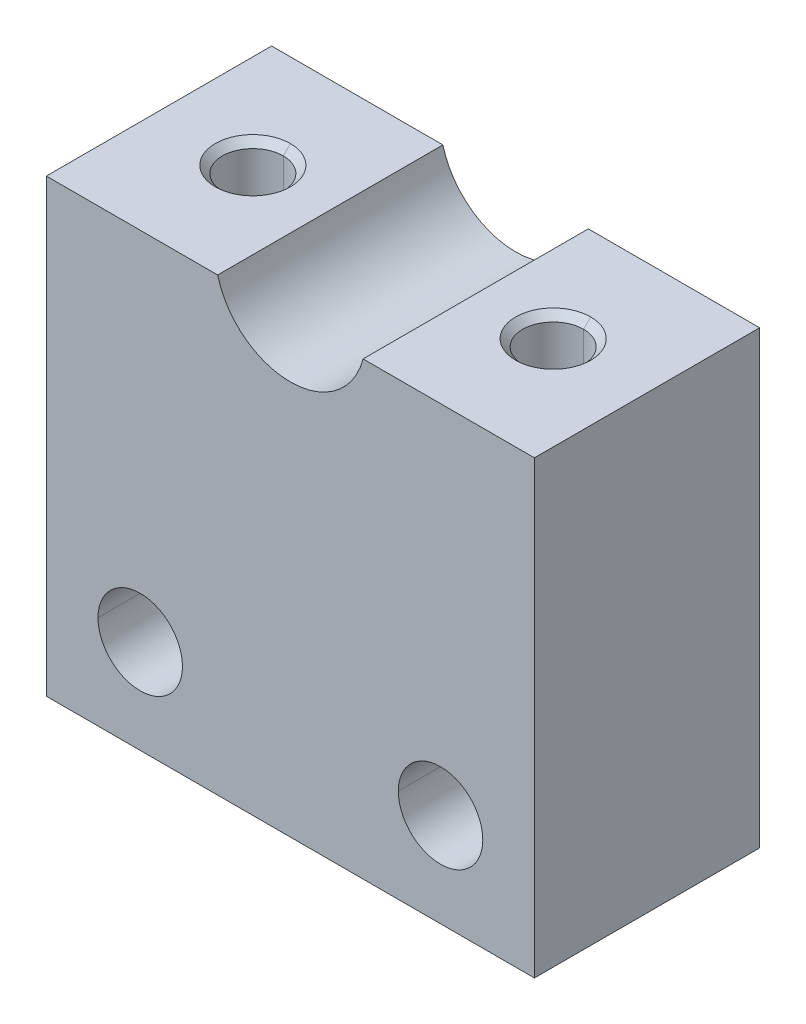
ISO-10303-21;
HEADER;
FILE_DESCRIPTION(('STEP AP214'),'2;1');
FILE_NAME('part.step','',(''),(''),'','','');
FILE_SCHEMA(('AUTOMOTIVE_DESIGN { 1 0 10303 214 1 1 1 1 }'));
ENDSEC;
DATA;
#1=APPLICATION_CONTEXT('core data for automotive mechanical design processes');
#2=APPLICATION_PROTOCOL_DEFINITION('international standard','automotive_design',2000,#1);
#3=PRODUCT_CONTEXT('',#1,'mechanical');
#4=PRODUCT('Part','Part','',(#3));
#5=PRODUCT_RELATED_PRODUCT_CATEGORY('part','',(#4));
#6=PRODUCT_DEFINITION_FORMATION('','',#4);
#7=PRODUCT_DEFINITION_CONTEXT('part definition',#1,'design');
#8=PRODUCT_DEFINITION('design','',#6,#7);
#9=PRODUCT_DEFINITION_SHAPE('','',#8);
#10=(LENGTH_UNIT() NAMED_UNIT(*) SI_UNIT(.MILLI.,.METRE.));
#11=(NAMED_UNIT(*) PLANE_ANGLE_UNIT() SI_UNIT($,.RADIAN.));
#12=(NAMED_UNIT(*) SI_UNIT($,.STERADIAN.) SOLID_ANGLE_UNIT());
#13=UNCERTAINTY_MEASURE_WITH_UNIT(LENGTH_MEASURE(1.E-05),#10,'distance_accuracy_value','');
#14=(GEOMETRIC_REPRESENTATION_CONTEXT(3) GLOBAL_UNCERTAINTY_ASSIGNED_CONTEXT((#13)) GLOBAL_UNIT_ASSIGNED_CONTEXT((#10,
#11,#12)) REPRESENTATION_CONTEXT('',''));
#15=CARTESIAN_POINT('',(0.,0.,0.));
#16=DIRECTION('',(0.,0.,1.));
#17=DIRECTION('',(1.,0.,0.));
#18=AXIS2_PLACEMENT_3D('',#15,#16,#17);
#19=CARTESIAN_POINT('',(-3.8729833462074,24.,6.));
#20=DIRECTION('',(0.,-1.,0.));
#21=DIRECTION('',(0.,0.,-1.));
#22=AXIS2_PLACEMENT_3D('',#19,#20,#21);
#23=PLANE('',#22);
#24=CARTESIAN_POINT('',(-8.,24.,0.));
#25=DIRECTION('',(0.,1.,0.));
#26=DIRECTION('',(0.,0.,1.));
#27=AXIS2_PLACEMENT_3D('',#24,#25,#26);
#28=CIRCLE('',#27,2.);
#29=CARTESIAN_POINT('',(-8.,24.,-2.));
#30=VERTEX_POINT('',#29);
#31=CARTESIAN_POINT('',(-8.,24.,2.));
#32=VERTEX_POINT('',#31);
#33=EDGE_CURVE('E11',#30,#32,#28,.T.);
#34=ORIENTED_EDGE('',*,*,#33,.F.);
#35=CARTESIAN_POINT('',(-8.,24.,0.));
#36=DIRECTION('',(0.,1.,0.));
#37=DIRECTION('',(0.,0.,1.));
#38=AXIS2_PLACEMENT_3D('',#35,#36,#37);
#39=CIRCLE('',#38,2.);
#40=EDGE_CURVE('E25',#32,#30,#39,.T.);
#41=ORIENTED_EDGE('',*,*,#40,.F.);
#42=EDGE_LOOP('',(#34,#41));
#43=FACE_BOUND('',#42,.T.);
#44=DIRECTION('',(-1.,0.,0.));
#45=VECTOR('',#44,1.);
#46=CARTESIAN_POINT('',(-3.8729833462074,24.,-6.));
#47=LINE('',#46,#45);
#48=CARTESIAN_POINT('',(-3.8729833462074,24.,-6.));
#49=VERTEX_POINT('',#48);
#50=CARTESIAN_POINT('',(-13.,24.,-6.));
#51=VERTEX_POINT('',#50);
#52=EDGE_CURVE('E389',#49,#51,#47,.T.);
#53=ORIENTED_EDGE('',*,*,#52,.T.);
#54=DIRECTION('',(0.,0.,-1.));
#55=VECTOR('',#54,1.);
#56=CARTESIAN_POINT('',(-13.,24.,6.));
#57=LINE('',#56,#55);
#58=CARTESIAN_POINT('',(-13.,24.,6.));
#59=VERTEX_POINT('',#58);
#60=EDGE_CURVE('E384',#59,#51,#57,.T.);
#61=ORIENTED_EDGE('',*,*,#60,.F.);
#62=DIRECTION('',(-1.,0.,0.));
#63=VECTOR('',#62,1.);
#64=CARTESIAN_POINT('',(-3.8729833462074,24.,6.));
#65=LINE('',#64,#63);
#66=CARTESIAN_POINT('',(-3.8729833462074,24.,6.));
#67=VERTEX_POINT('',#66);
#68=EDGE_CURVE('E378',#67,#59,#65,.T.);
#69=ORIENTED_EDGE('',*,*,#68,.F.);
#70=DIRECTION('',(0.,0.,-1.));
#71=VECTOR('',#70,1.);
#72=CARTESIAN_POINT('',(-3.8729833462074,24.,6.));
#73=LINE('',#72,#71);
#74=EDGE_CURVE('E373',#67,#49,#73,.T.);
#75=ORIENTED_EDGE('',*,*,#74,.T.);
#76=EDGE_LOOP('',(#53,#61,#69,#75));
#77=FACE_BOUND('',#76,.T.);
#78=ADVANCED_FACE('F17',(#43,#77),#23,.F.);
#79=CARTESIAN_POINT('',(0.,25.,6.));
#80=DIRECTION('',(0.,0.,-1.));
#81=DIRECTION('',(0.,1.,0.));
#82=AXIS2_PLACEMENT_3D('',#79,#80,#81);
#83=CYLINDRICAL_SURFACE('',#82,4.);
#84=CARTESIAN_POINT('',(0.,25.,-6.));
#85=DIRECTION('',(0.,0.,1.));
#86=DIRECTION('',(1.,0.,0.));
#87=AXIS2_PLACEMENT_3D('',#84,#85,#86);
#88=CIRCLE('',#87,4.);
#89=CARTESIAN_POINT('',(3.8729833462074,24.,-6.));
#90=VERTEX_POINT('',#89);
#91=EDGE_CURVE('E367',#49,#90,#88,.T.);
#92=ORIENTED_EDGE('',*,*,#91,.F.);
#93=ORIENTED_EDGE('',*,*,#74,.F.);
#94=CARTESIAN_POINT('',(0.,25.,6.));
#95=DIRECTION('',(0.,0.,1.));
#96=DIRECTION('',(1.,0.,0.));
#97=AXIS2_PLACEMENT_3D('',#94,#95,#96);
#98=CIRCLE('',#97,4.);
#99=CARTESIAN_POINT('',(3.8729833462074,24.,6.));
#100=VERTEX_POINT('',#99);
#101=EDGE_CURVE('E362',#67,#100,#98,.T.);
#102=ORIENTED_EDGE('',*,*,#101,.T.);
#103=DIRECTION('',(0.,0.,-1.));
#104=VECTOR('',#103,1.);
#105=CARTESIAN_POINT('',(3.8729833462074,24.,6.));
#106=LINE('',#105,#104);
#107=EDGE_CURVE('E357',#100,#90,#106,.T.);
#108=ORIENTED_EDGE('',*,*,#107,.T.);
#109=EDGE_LOOP('',(#92,#93,#102,#108));
#110=FACE_BOUND('',#109,.T.);
#111=ADVANCED_FACE('F422',(#110),#83,.F.);
#112=CARTESIAN_POINT('',(13.,24.,6.));
#113=DIRECTION('',(0.,-1.,0.));
#114=DIRECTION('',(0.,0.,-1.));
#115=AXIS2_PLACEMENT_3D('',#112,#113,#114);
#116=PLANE('',#115);
#117=CARTESIAN_POINT('',(8.,24.,0.));
#118=DIRECTION('',(0.,1.,0.));
#119=DIRECTION('',(0.,0.,1.));
#120=AXIS2_PLACEMENT_3D('',#117,#118,#119);
#121=CIRCLE('',#120,2.);
#122=CARTESIAN_POINT('',(8.,24.,-2.));
#123=VERTEX_POINT('',#122);
#124=CARTESIAN_POINT('',(8.,24.,2.));
#125=VERTEX_POINT('',#124);
#126=EDGE_CURVE('E351',#123,#125,#121,.T.);
#127=ORIENTED_EDGE('',*,*,#126,.F.);
#128=CARTESIAN_POINT('',(8.,24.,0.));
#129=DIRECTION('',(0.,1.,0.));
#130=DIRECTION('',(0.,0.,1.));
#131=AXIS2_PLACEMENT_3D('',#128,#129,#130);
#132=CIRCLE('',#131,2.);
#133=EDGE_CURVE('E346',#125,#123,#132,.T.);
#134=ORIENTED_EDGE('',*,*,#133,.F.);
#135=EDGE_LOOP('',(#127,#134));
#136=FACE_BOUND('',#135,.T.);
#137=DIRECTION('',(-1.,0.,0.));
#138=VECTOR('',#137,1.);
#139=CARTESIAN_POINT('',(13.,24.,-6.));
#140=LINE('',#139,#138);
#141=CARTESIAN_POINT('',(13.,24.,-6.));
#142=VERTEX_POINT('',#141);
#143=EDGE_CURVE('E340',#142,#90,#140,.T.);
#144=ORIENTED_EDGE('',*,*,#143,.T.);
#145=ORIENTED_EDGE('',*,*,#107,.F.);
#146=DIRECTION('',(-1.,0.,0.));
#147=VECTOR('',#146,1.);
#148=CARTESIAN_POINT('',(13.,24.,6.));
#149=LINE('',#148,#147);
#150=CARTESIAN_POINT('',(13.,24.,6.));
#151=VERTEX_POINT('',#150);
#152=EDGE_CURVE('E334',#151,#100,#149,.T.);
#153=ORIENTED_EDGE('',*,*,#152,.F.);
#154=DIRECTION('',(0.,0.,-1.));
#155=VECTOR('',#154,1.);
#156=CARTESIAN_POINT('',(13.,24.,6.));
#157=LINE('',#156,#155);
#158=EDGE_CURVE('E330',#151,#142,#157,.T.);
#159=ORIENTED_EDGE('',*,*,#158,.T.);
#160=EDGE_LOOP('',(#144,#145,#153,#159));
#161=FACE_BOUND('',#160,.T.);
#162=ADVANCED_FACE('F427',(#136,#161),#116,.F.);
#163=CARTESIAN_POINT('',(13.,0.,6.));
#164=DIRECTION('',(-1.,0.,0.));
#165=DIRECTION('',(0.,0.,1.));
#166=AXIS2_PLACEMENT_3D('',#163,#164,#165);
#167=PLANE('',#166);
#168=DIRECTION('',(0.,1.,0.));
#169=VECTOR('',#168,1.);
#170=CARTESIAN_POINT('',(13.,0.,-6.));
#171=LINE('',#170,#169);
#172=CARTESIAN_POINT('',(13.,0.,-6.));
#173=VERTEX_POINT('',#172);
#174=EDGE_CURVE('E325',#173,#142,#171,.T.);
#175=ORIENTED_EDGE('',*,*,#174,.T.);
#176=ORIENTED_EDGE('',*,*,#158,.F.);
#177=DIRECTION('',(0.,1.,0.));
#178=VECTOR('',#177,1.);
#179=CARTESIAN_POINT('',(13.,0.,6.));
#180=LINE('',#179,#178);
#181=CARTESIAN_POINT('',(13.,0.,6.));
#182=VERTEX_POINT('',#181);
#183=EDGE_CURVE('E320',#182,#151,#180,.T.);
#184=ORIENTED_EDGE('',*,*,#183,.F.);
#185=DIRECTION('',(0.,0.,-1.));
#186=VECTOR('',#185,1.);
#187=CARTESIAN_POINT('',(13.,0.,6.));
#188=LINE('',#187,#186);
#189=EDGE_CURVE('E316',#182,#173,#188,.T.);
#190=ORIENTED_EDGE('',*,*,#189,.T.);
#191=EDGE_LOOP('',(#175,#176,#184,#190));
#192=FACE_BOUND('',#191,.T.);
#193=ADVANCED_FACE('F450',(#192),#167,.F.);
#194=CARTESIAN_POINT('',(-13.,0.,6.));
#195=DIRECTION('',(0.,1.,0.));
#196=DIRECTION('',(0.,0.,1.));
#197=AXIS2_PLACEMENT_3D('',#194,#195,#196);
#198=PLANE('',#197);
#199=DIRECTION('',(1.,0.,0.));
#200=VECTOR('',#199,1.);
#201=CARTESIAN_POINT('',(-13.,0.,-6.));
#202=LINE('',#201,#200);
#203=CARTESIAN_POINT('',(-13.,0.,-6.));
#204=VERTEX_POINT('',#203);
#205=EDGE_CURVE('E311',#204,#173,#202,.T.);
#206=ORIENTED_EDGE('',*,*,#205,.T.);
#207=ORIENTED_EDGE('',*,*,#189,.F.);
#208=DIRECTION('',(1.,0.,0.));
#209=VECTOR('',#208,1.);
#210=CARTESIAN_POINT('',(-13.,0.,6.));
#211=LINE('',#210,#209);
#212=CARTESIAN_POINT('',(-13.,0.,6.));
#213=VERTEX_POINT('',#212);
#214=EDGE_CURVE('E306',#213,#182,#211,.T.);
#215=ORIENTED_EDGE('',*,*,#214,.F.);
#216=DIRECTION('',(0.,0.,-1.));
#217=VECTOR('',#216,1.);
#218=CARTESIAN_POINT('',(-13.,0.,6.));
#219=LINE('',#218,#217);
#220=EDGE_CURVE('E302',#213,#204,#219,.T.);
#221=ORIENTED_EDGE('',*,*,#220,.T.);
#222=EDGE_LOOP('',(#206,#207,#215,#221));
#223=FACE_BOUND('',#222,.T.);
#224=ADVANCED_FACE('F453',(#223),#198,.F.);
#225=CARTESIAN_POINT('',(-13.,24.,6.));
#226=DIRECTION('',(1.,0.,0.));
#227=DIRECTION('',(0.,0.,-1.));
#228=AXIS2_PLACEMENT_3D('',#225,#226,#227);
#229=PLANE('',#228);
#230=DIRECTION('',(0.,-1.,0.));
#231=VECTOR('',#230,1.);
#232=CARTESIAN_POINT('',(-13.,24.,-6.));
#233=LINE('',#232,#231);
#234=EDGE_CURVE('E297',#51,#204,#233,.T.);
#235=ORIENTED_EDGE('',*,*,#234,.T.);
#236=ORIENTED_EDGE('',*,*,#220,.F.);
#237=DIRECTION('',(0.,-1.,0.));
#238=VECTOR('',#237,1.);
#239=CARTESIAN_POINT('',(-13.,24.,6.));
#240=LINE('',#239,#238);
#241=EDGE_CURVE('E292',#59,#213,#240,.T.);
#242=ORIENTED_EDGE('',*,*,#241,.F.);
#243=ORIENTED_EDGE('',*,*,#60,.T.);
#244=EDGE_LOOP('',(#235,#236,#242,#243));
#245=FACE_BOUND('',#244,.T.);
#246=ADVANCED_FACE('F441',(#245),#229,.F.);
#247=CARTESIAN_POINT('',(0.,25.,6.));
#248=DIRECTION('',(0.,0.,1.));
#249=DIRECTION('',(1.,0.,0.));
#250=AXIS2_PLACEMENT_3D('',#247,#248,#249);
#251=PLANE('',#250);
#252=CARTESIAN_POINT('',(-8.,5.,6.));
#253=DIRECTION('',(0.,0.,1.));
#254=DIRECTION('',(1.,0.,0.));
#255=AXIS2_PLACEMENT_3D('',#252,#253,#254);
#256=CIRCLE('',#255,2.25);
#257=CARTESIAN_POINT('',(-10.25,5.,6.));
#258=VERTEX_POINT('',#257);
#259=CARTESIAN_POINT('',(-5.75,5.,6.));
#260=VERTEX_POINT('',#259);
#261=EDGE_CURVE('E287',#258,#260,#256,.T.);
#262=ORIENTED_EDGE('',*,*,#261,.F.);
#263=CARTESIAN_POINT('',(-8.,5.,6.));
#264=DIRECTION('',(0.,0.,1.));
#265=DIRECTION('',(1.,0.,0.));
#266=AXIS2_PLACEMENT_3D('',#263,#264,#265);
#267=CIRCLE('',#266,2.25);
#268=EDGE_CURVE('E282',#260,#258,#267,.T.);
#269=ORIENTED_EDGE('',*,*,#268,.F.);
#270=EDGE_LOOP('',(#262,#269));
#271=FACE_BOUND('',#270,.T.);
#272=CARTESIAN_POINT('',(8.,5.,6.));
#273=DIRECTION('',(0.,0.,1.));
#274=DIRECTION('',(1.,0.,0.));
#275=AXIS2_PLACEMENT_3D('',#272,#273,#274);
#276=CIRCLE('',#275,2.25);
#277=CARTESIAN_POINT('',(5.75,5.,6.));
#278=VERTEX_POINT('',#277);
#279=CARTESIAN_POINT('',(10.25,5.,6.));
#280=VERTEX_POINT('',#279);
#281=EDGE_CURVE('E277',#278,#280,#276,.T.);
#282=ORIENTED_EDGE('',*,*,#281,.F.);
#283=CARTESIAN_POINT('',(8.,5.,6.));
#284=DIRECTION('',(0.,0.,1.));
#285=DIRECTION('',(1.,0.,0.));
#286=AXIS2_PLACEMENT_3D('',#283,#284,#285);
#287=CIRCLE('',#286,2.25);
#288=EDGE_CURVE('E272',#280,#278,#287,.T.);
#289=ORIENTED_EDGE('',*,*,#288,.F.);
#290=EDGE_LOOP('',(#282,#289));
#291=FACE_BOUND('',#290,.T.);
#292=ORIENTED_EDGE('',*,*,#68,.T.);
#293=ORIENTED_EDGE('',*,*,#241,.T.);
#294=ORIENTED_EDGE('',*,*,#214,.T.);
#295=ORIENTED_EDGE('',*,*,#183,.T.);
#296=ORIENTED_EDGE('',*,*,#152,.T.);
#297=ORIENTED_EDGE('',*,*,#101,.F.);
#298=EDGE_LOOP('',(#292,#293,#294,#295,#296,#297));
#299=FACE_BOUND('',#298,.T.);
#300=ADVANCED_FACE('F444',(#271,#291,#299),#251,.T.);
#301=CARTESIAN_POINT('',(8.,5.,6.));
#302=DIRECTION('',(0.,0.,-1.));
#303=DIRECTION('',(0.,-1.,0.));
#304=AXIS2_PLACEMENT_3D('',#301,#302,#303);
#305=CYLINDRICAL_SURFACE('',#304,2.25);
#306=DIRECTION('',(0.,0.,-1.));
#307=VECTOR('',#306,1.);
#308=CARTESIAN_POINT('',(10.25,5.,6.));
#309=LINE('',#308,#307);
#310=CARTESIAN_POINT('',(10.25,5.,-6.));
#311=VERTEX_POINT('',#310);
#312=EDGE_CURVE('E267',#280,#311,#309,.T.);
#313=ORIENTED_EDGE('',*,*,#312,.F.);
#314=ORIENTED_EDGE('',*,*,#288,.T.);
#315=DIRECTION('',(0.,0.,-1.));
#316=VECTOR('',#315,1.);
#317=CARTESIAN_POINT('',(5.75,5.,6.));
#318=LINE('',#317,#316);
#319=CARTESIAN_POINT('',(5.75,5.,-6.));
#320=VERTEX_POINT('',#319);
#321=EDGE_CURVE('E263',#278,#320,#318,.T.);
#322=ORIENTED_EDGE('',*,*,#321,.T.);
#323=CARTESIAN_POINT('',(8.,5.,-6.));
#324=DIRECTION('',(0.,0.,1.));
#325=DIRECTION('',(1.,0.,0.));
#326=AXIS2_PLACEMENT_3D('',#323,#324,#325);
#327=CIRCLE('',#326,2.25);
#328=EDGE_CURVE('E258',#311,#320,#327,.T.);
#329=ORIENTED_EDGE('',*,*,#328,.F.);
#330=EDGE_LOOP('',(#313,#314,#322,#329));
#331=FACE_BOUND('',#330,.T.);
#332=ADVANCED_FACE('F512',(#331),#305,.F.);
#333=CARTESIAN_POINT('',(0.,25.,-6.));
#334=DIRECTION('',(0.,0.,1.));
#335=DIRECTION('',(1.,0.,0.));
#336=AXIS2_PLACEMENT_3D('',#333,#334,#335);
#337=PLANE('',#336);
#338=CARTESIAN_POINT('',(-8.,5.,-6.));
#339=DIRECTION('',(0.,0.,1.));
#340=DIRECTION('',(1.,0.,0.));
#341=AXIS2_PLACEMENT_3D('',#338,#339,#340);
#342=CIRCLE('',#341,2.25);
#343=CARTESIAN_POINT('',(-5.75,5.,-6.));
#344=VERTEX_POINT('',#343);
#345=CARTESIAN_POINT('',(-10.25,5.,-6.));
#346=VERTEX_POINT('',#345);
#347=EDGE_CURVE('E254',#344,#346,#342,.T.);
#348=ORIENTED_EDGE('',*,*,#347,.T.);
#349=CARTESIAN_POINT('',(-8.,5.,-6.));
#350=DIRECTION('',(0.,0.,1.));
#351=DIRECTION('',(1.,0.,0.));
#352=AXIS2_PLACEMENT_3D('',#349,#350,#351);
#353=CIRCLE('',#352,2.25);
#354=EDGE_CURVE('E250',#346,#344,#353,.T.);
#355=ORIENTED_EDGE('',*,*,#354,.T.);
#356=EDGE_LOOP('',(#348,#355));
#357=FACE_BOUND('',#356,.T.);
#358=ORIENTED_EDGE('',*,*,#328,.T.);
#359=CARTESIAN_POINT('',(8.,5.,-6.));
#360=DIRECTION('',(0.,0.,1.));
#361=DIRECTION('',(1.,0.,0.));
#362=AXIS2_PLACEMENT_3D('',#359,#360,#361);
#363=CIRCLE('',#362,2.25);
#364=EDGE_CURVE('E245',#320,#311,#363,.T.);
#365=ORIENTED_EDGE('',*,*,#364,.T.);
#366=EDGE_LOOP('',(#358,#365));
#367=FACE_BOUND('',#366,.T.);
#368=ORIENTED_EDGE('',*,*,#52,.F.);
#369=ORIENTED_EDGE('',*,*,#91,.T.);
#370=ORIENTED_EDGE('',*,*,#143,.F.);
#371=ORIENTED_EDGE('',*,*,#174,.F.);
#372=ORIENTED_EDGE('',*,*,#205,.F.);
#373=ORIENTED_EDGE('',*,*,#234,.F.);
#374=EDGE_LOOP('',(#368,#369,#370,#371,#372,#373));
#375=FACE_BOUND('',#374,.T.);
#376=ADVANCED_FACE('F437',(#357,#367,#375),#337,.F.);
#377=CARTESIAN_POINT('',(8.,5.,6.));
#378=DIRECTION('',(0.,0.,-1.));
#379=DIRECTION('',(0.,1.,0.));
#380=AXIS2_PLACEMENT_3D('',#377,#378,#379);
#381=CYLINDRICAL_SURFACE('',#380,2.25);
#382=ORIENTED_EDGE('',*,*,#312,.T.);
#383=ORIENTED_EDGE('',*,*,#364,.F.);
#384=ORIENTED_EDGE('',*,*,#321,.F.);
#385=ORIENTED_EDGE('',*,*,#281,.T.);
#386=EDGE_LOOP('',(#382,#383,#384,#385));
#387=FACE_BOUND('',#386,.T.);
#388=ADVANCED_FACE('F506',(#387),#381,.F.);
#389=CARTESIAN_POINT('',(-8.,5.,6.));
#390=DIRECTION('',(0.,0.,-1.));
#391=DIRECTION('',(0.,1.,0.));
#392=AXIS2_PLACEMENT_3D('',#389,#390,#391);
#393=CYLINDRICAL_SURFACE('',#392,2.25);
#394=DIRECTION('',(0.,0.,-1.));
#395=VECTOR('',#394,1.);
#396=CARTESIAN_POINT('',(-5.75,5.,6.));
#397=LINE('',#396,#395);
#398=EDGE_CURVE('E240',#260,#344,#397,.T.);
#399=ORIENTED_EDGE('',*,*,#398,.T.);
#400=ORIENTED_EDGE('',*,*,#354,.F.);
#401=DIRECTION('',(0.,0.,-1.));
#402=VECTOR('',#401,1.);
#403=CARTESIAN_POINT('',(-10.25,5.,6.));
#404=LINE('',#403,#402);
#405=EDGE_CURVE('E235',#258,#346,#404,.T.);
#406=ORIENTED_EDGE('',*,*,#405,.F.);
#407=ORIENTED_EDGE('',*,*,#261,.T.);
#408=EDGE_LOOP('',(#399,#400,#406,#407));
#409=FACE_BOUND('',#408,.T.);
#410=ADVANCED_FACE('F502',(#409),#393,.F.);
#411=CARTESIAN_POINT('',(-8.,5.,6.));
#412=DIRECTION('',(0.,0.,-1.));
#413=DIRECTION('',(0.,-1.,0.));
#414=AXIS2_PLACEMENT_3D('',#411,#412,#413);
#415=CYLINDRICAL_SURFACE('',#414,2.25);
#416=ORIENTED_EDGE('',*,*,#398,.F.);
#417=ORIENTED_EDGE('',*,*,#268,.T.);
#418=ORIENTED_EDGE('',*,*,#405,.T.);
#419=ORIENTED_EDGE('',*,*,#347,.F.);
#420=EDGE_LOOP('',(#416,#417,#418,#419));
#421=FACE_BOUND('',#420,.T.);
#422=ADVANCED_FACE('F499',(#421),#415,.F.);
#423=CARTESIAN_POINT('',(8.,23.621,0.));
#424=DIRECTION('',(0.,1.,0.));
#425=DIRECTION('',(-1.,0.,0.));
#426=AXIS2_PLACEMENT_3D('',#423,#424,#425);
#427=CONICAL_SURFACE('',#426,1.621,0.785398163397448);
#428=DIRECTION('',(0.,0.707106781186549,-0.707106781186546));
#429=VECTOR('',#428,1.);
#430=CARTESIAN_POINT('',(8.,23.621,-1.621));
#431=LINE('',#430,#429);
#432=CARTESIAN_POINT('',(8.,23.621,-1.621));
#433=VERTEX_POINT('',#432);
#434=EDGE_CURVE('E230',#433,#123,#431,.T.);
#435=ORIENTED_EDGE('',*,*,#434,.F.);
#436=CARTESIAN_POINT('',(8.,23.621,0.));
#437=DIRECTION('',(0.,1.,0.));
#438=DIRECTION('',(0.,0.,1.));
#439=AXIS2_PLACEMENT_3D('',#436,#437,#438);
#440=CIRCLE('',#439,1.621);
#441=CARTESIAN_POINT('',(8.,23.621,1.621));
#442=VERTEX_POINT('',#441);
#443=EDGE_CURVE('E225',#442,#433,#440,.T.);
#444=ORIENTED_EDGE('',*,*,#443,.F.);
#445=DIRECTION('',(0.,0.707106781186549,0.707106781186546));
#446=VECTOR('',#445,1.);
#447=CARTESIAN_POINT('',(8.,23.621,1.621));
#448=LINE('',#447,#446);
#449=EDGE_CURVE('E220',#442,#125,#448,.T.);
#450=ORIENTED_EDGE('',*,*,#449,.T.);
#451=ORIENTED_EDGE('',*,*,#133,.T.);
#452=EDGE_LOOP('',(#435,#444,#450,#451));
#453=FACE_BOUND('',#452,.T.);
#454=ADVANCED_FACE('F473',(#453),#427,.F.);
#455=CARTESIAN_POINT('',(8.,23.621,0.));
#456=DIRECTION('',(0.,1.,0.));
#457=DIRECTION('',(1.,0.,0.));
#458=AXIS2_PLACEMENT_3D('',#455,#456,#457);
#459=CONICAL_SURFACE('',#458,1.621,0.785398163397448);
#460=ORIENTED_EDGE('',*,*,#434,.T.);
#461=ORIENTED_EDGE('',*,*,#126,.T.);
#462=ORIENTED_EDGE('',*,*,#449,.F.);
#463=CARTESIAN_POINT('',(8.,23.621,0.));
#464=DIRECTION('',(0.,1.,0.));
#465=DIRECTION('',(0.,0.,1.));
#466=AXIS2_PLACEMENT_3D('',#463,#464,#465);
#467=CIRCLE('',#466,1.621);
#468=EDGE_CURVE('E214',#433,#442,#467,.T.);
#469=ORIENTED_EDGE('',*,*,#468,.F.);
#470=EDGE_LOOP('',(#460,#461,#462,#469));
#471=FACE_BOUND('',#470,.T.);
#472=ADVANCED_FACE('F471',(#471),#459,.F.);
#473=CARTESIAN_POINT('',(8.,24.,0.));
#474=DIRECTION('',(0.,1.,0.));
#475=DIRECTION('',(1.,0.,0.));
#476=AXIS2_PLACEMENT_3D('',#473,#474,#475);
#477=CYLINDRICAL_SURFACE('',#476,1.621);
#478=DIRECTION('',(0.,1.,0.));
#479=VECTOR('',#478,1.);
#480=CARTESIAN_POINT('',(8.,17.935884786356,-1.621));
#481=LINE('',#480,#479);
#482=CARTESIAN_POINT('',(8.,17.935884786356,-1.621));
#483=VERTEX_POINT('',#482);
#484=EDGE_CURVE('E209',#483,#433,#481,.T.);
#485=ORIENTED_EDGE('',*,*,#484,.T.);
#486=ORIENTED_EDGE('',*,*,#468,.T.);
#487=DIRECTION('',(0.,1.,0.));
#488=VECTOR('',#487,1.);
#489=CARTESIAN_POINT('',(8.,17.935884786356,1.621));
#490=LINE('',#489,#488);
#491=CARTESIAN_POINT('',(8.,17.935884786356,1.621));
#492=VERTEX_POINT('',#491);
#493=EDGE_CURVE('E204',#492,#442,#490,.T.);
#494=ORIENTED_EDGE('',*,*,#493,.F.);
#495=CARTESIAN_POINT('',(8.,17.935884786356,0.));
#496=DIRECTION('',(0.,1.,0.));
#497=DIRECTION('',(0.,0.,1.));
#498=AXIS2_PLACEMENT_3D('',#495,#496,#497);
#499=CIRCLE('',#498,1.621);
#500=EDGE_CURVE('E199',#483,#492,#499,.T.);
#501=ORIENTED_EDGE('',*,*,#500,.F.);
#502=EDGE_LOOP('',(#485,#486,#494,#501));
#503=FACE_BOUND('',#502,.T.);
#504=ADVANCED_FACE('F475',(#503),#477,.F.);
#505=CARTESIAN_POINT('',(8.,17.,0.));
#506=DIRECTION('',(0.,1.,0.));
#507=DIRECTION('',(1.,0.,0.));
#508=AXIS2_PLACEMENT_3D('',#505,#506,#507);
#509=CONICAL_SURFACE('',#508,0.,1.04719755119678);
#510=DIRECTION('',(0.,0.499999999999846,-0.866025403784528));
#511=VECTOR('',#510,1.);
#512=CARTESIAN_POINT('',(8.,17.,0.));
#513=LINE('',#512,#511);
#514=CARTESIAN_POINT('',(8.,17.,0.));
#515=VERTEX_POINT('',#514);
#516=EDGE_CURVE('E194',#515,#483,#513,.T.);
#517=ORIENTED_EDGE('',*,*,#516,.T.);
#518=ORIENTED_EDGE('',*,*,#500,.T.);
#519=DIRECTION('',(0.,0.499999999999846,0.866025403784528));
#520=VECTOR('',#519,1.);
#521=CARTESIAN_POINT('',(8.,17.,0.));
#522=LINE('',#521,#520);
#523=EDGE_CURVE('E189',#515,#492,#522,.T.);
#524=ORIENTED_EDGE('',*,*,#523,.F.);
#525=EDGE_LOOP('',(#517,#518,#524));
#526=FACE_BOUND('',#525,.T.);
#527=ADVANCED_FACE('F484',(#526),#509,.F.);
#528=CARTESIAN_POINT('',(8.,17.,0.));
#529=DIRECTION('',(0.,1.,0.));
#530=DIRECTION('',(-1.,0.,0.));
#531=AXIS2_PLACEMENT_3D('',#528,#529,#530);
#532=CONICAL_SURFACE('',#531,0.,1.04719755119678);
#533=ORIENTED_EDGE('',*,*,#523,.T.);
#534=CARTESIAN_POINT('',(8.,17.935884786356,0.));
#535=DIRECTION('',(0.,1.,0.));
#536=DIRECTION('',(0.,0.,1.));
#537=AXIS2_PLACEMENT_3D('',#534,#535,#536);
#538=CIRCLE('',#537,1.621);
#539=EDGE_CURVE('E184',#492,#483,#538,.T.);
#540=ORIENTED_EDGE('',*,*,#539,.T.);
#541=ORIENTED_EDGE('',*,*,#516,.F.);
#542=EDGE_LOOP('',(#533,#540,#541));
#543=FACE_BOUND('',#542,.T.);
#544=ADVANCED_FACE('F482',(#543),#532,.F.);
#545=CARTESIAN_POINT('',(8.,24.,0.));
#546=DIRECTION('',(0.,1.,0.));
#547=DIRECTION('',(-1.,0.,0.));
#548=AXIS2_PLACEMENT_3D('',#545,#546,#547);
#549=CYLINDRICAL_SURFACE('',#548,1.621);
#550=ORIENTED_EDGE('',*,*,#484,.F.);
#551=ORIENTED_EDGE('',*,*,#539,.F.);
#552=ORIENTED_EDGE('',*,*,#493,.T.);
#553=ORIENTED_EDGE('',*,*,#443,.T.);
#554=EDGE_LOOP('',(#550,#551,#552,#553));
#555=FACE_BOUND('',#554,.T.);
#556=ADVANCED_FACE('F479',(#555),#549,.F.);
#557=CARTESIAN_POINT('',(-8.,23.621,0.));
#558=DIRECTION('',(0.,1.,0.));
#559=DIRECTION('',(-1.,0.,0.));
#560=AXIS2_PLACEMENT_3D('',#557,#558,#559);
#561=CONICAL_SURFACE('',#560,1.621,0.785398163397446);
#562=DIRECTION('',(0.,0.707106781186549,-0.707106781186546));
#563=VECTOR('',#562,1.);
#564=CARTESIAN_POINT('',(-8.,23.621,-1.621));
#565=LINE('',#564,#563);
#566=CARTESIAN_POINT('',(-8.,23.621,-1.621));
#567=VERTEX_POINT('',#566);
#568=EDGE_CURVE('E180',#567,#30,#565,.T.);
#569=ORIENTED_EDGE('',*,*,#568,.F.);
#570=CARTESIAN_POINT('',(-8.,23.621,0.));
#571=DIRECTION('',(0.,1.,0.));
#572=DIRECTION('',(0.,0.,1.));
#573=AXIS2_PLACEMENT_3D('',#570,#571,#572);
#574=CIRCLE('',#573,1.621);
#575=CARTESIAN_POINT('',(-8.,23.621,1.621));
#576=VERTEX_POINT('',#575);
#577=EDGE_CURVE('E174',#576,#567,#574,.T.);
#578=ORIENTED_EDGE('',*,*,#577,.F.);
#579=DIRECTION('',(0.,0.707106781186549,0.707106781186546));
#580=VECTOR('',#579,1.);
#581=CARTESIAN_POINT('',(-8.,23.621,1.621));
#582=LINE('',#581,#580);
#583=EDGE_CURVE('E170',#576,#32,#582,.T.);
#584=ORIENTED_EDGE('',*,*,#583,.T.);
#585=ORIENTED_EDGE('',*,*,#40,.T.);
#586=EDGE_LOOP('',(#569,#578,#584,#585));
#587=FACE_BOUND('',#586,.T.);
#588=ADVANCED_FACE('F401',(#587),#561,.F.);
#589=CARTESIAN_POINT('',(-8.,23.621,0.));
#590=DIRECTION('',(0.,1.,0.));
#591=DIRECTION('',(1.,0.,0.));
#592=AXIS2_PLACEMENT_3D('',#589,#590,#591);
#593=CONICAL_SURFACE('',#592,1.621,0.785398163397446);
#594=ORIENTED_EDGE('',*,*,#568,.T.);
#595=ORIENTED_EDGE('',*,*,#33,.T.);
#596=ORIENTED_EDGE('',*,*,#583,.F.);
#597=CARTESIAN_POINT('',(-8.,23.621,0.));
#598=DIRECTION('',(0.,1.,0.));
#599=DIRECTION('',(0.,0.,1.));
#600=AXIS2_PLACEMENT_3D('',#597,#598,#599);
#601=CIRCLE('',#600,1.621);
#602=EDGE_CURVE('E165',#567,#576,#601,.T.);
#603=ORIENTED_EDGE('',*,*,#602,.F.);
#604=EDGE_LOOP('',(#594,#595,#596,#603));
#605=FACE_BOUND('',#604,.T.);
#606=ADVANCED_FACE('F405',(#605),#593,.F.);
#607=CARTESIAN_POINT('',(-8.,24.,0.));
#608=DIRECTION('',(0.,1.,0.));
#609=DIRECTION('',(1.,0.,0.));
#610=AXIS2_PLACEMENT_3D('',#607,#608,#609);
#611=CYLINDRICAL_SURFACE('',#610,1.621);
#612=DIRECTION('',(0.,1.,0.));
#613=VECTOR('',#612,1.);
#614=CARTESIAN_POINT('',(-8.,17.935884786356,-1.621));
#615=LINE('',#614,#613);
#616=CARTESIAN_POINT('',(-8.,17.935884786356,-1.621));
#617=VERTEX_POINT('',#616);
#618=EDGE_CURVE('E160',#617,#567,#615,.T.);
#619=ORIENTED_EDGE('',*,*,#618,.T.);
#620=ORIENTED_EDGE('',*,*,#602,.T.);
#621=DIRECTION('',(0.,1.,0.));
#622=VECTOR('',#621,1.);
#623=CARTESIAN_POINT('',(-8.,17.935884786356,1.621));
#624=LINE('',#623,#622);
#625=CARTESIAN_POINT('',(-8.,17.935884786356,1.621));
#626=VERTEX_POINT('',#625);
#627=EDGE_CURVE('E149',#626,#576,#624,.T.);
#628=ORIENTED_EDGE('',*,*,#627,.F.);
#629=CARTESIAN_POINT('',(-8.,17.935884786356,0.));
#630=DIRECTION('',(0.,1.,0.));
#631=DIRECTION('',(0.,0.,1.));
#632=AXIS2_PLACEMENT_3D('',#629,#630,#631);
#633=CIRCLE('',#632,1.621);
#634=EDGE_CURVE('E141',#617,#626,#633,.T.);
#635=ORIENTED_EDGE('',*,*,#634,.F.);
#636=EDGE_LOOP('',(#619,#620,#628,#635));
#637=FACE_BOUND('',#636,.T.);
#638=ADVANCED_FACE('F408',(#637),#611,.F.);
#639=CARTESIAN_POINT('',(-8.,17.,0.));
#640=DIRECTION('',(0.,1.,0.));
#641=DIRECTION('',(1.,0.,0.));
#642=AXIS2_PLACEMENT_3D('',#639,#640,#641);
#643=CONICAL_SURFACE('',#642,0.,1.04719755119678);
#644=DIRECTION('',(0.,0.499999999999846,-0.866025403784528));
#645=VECTOR('',#644,1.);
#646=CARTESIAN_POINT('',(-8.,17.,0.));
#647=LINE('',#646,#645);
#648=CARTESIAN_POINT('',(-8.,17.,0.));
#649=VERTEX_POINT('',#648);
#650=EDGE_CURVE('E140',#649,#617,#647,.T.);
#651=ORIENTED_EDGE('',*,*,#650,.T.);
#652=ORIENTED_EDGE('',*,*,#634,.T.);
#653=DIRECTION('',(0.,0.499999999999846,0.866025403784528));
#654=VECTOR('',#653,1.);
#655=CARTESIAN_POINT('',(-8.,17.,0.));
#656=LINE('',#655,#654);
#657=EDGE_CURVE('E137',#649,#626,#656,.T.);
#658=ORIENTED_EDGE('',*,*,#657,.F.);
#659=EDGE_LOOP('',(#651,#652,#658));
#660=FACE_BOUND('',#659,.T.);
#661=ADVANCED_FACE('F139',(#660),#643,.F.);
#662=CARTESIAN_POINT('',(-8.,17.,0.));
#663=DIRECTION('',(0.,1.,0.));
#664=DIRECTION('',(-1.,0.,0.));
#665=AXIS2_PLACEMENT_3D('',#662,#663,#664);
#666=CONICAL_SURFACE('',#665,0.,1.04719755119678);
#667=ORIENTED_EDGE('',*,*,#657,.T.);
#668=CARTESIAN_POINT('',(-8.,17.935884786356,0.));
#669=DIRECTION('',(0.,1.,0.));
#670=DIRECTION('',(0.,0.,1.));
#671=AXIS2_PLACEMENT_3D('',#668,#669,#670);
#672=CIRCLE('',#671,1.621);
#673=EDGE_CURVE('E144',#626,#617,#672,.T.);
#674=ORIENTED_EDGE('',*,*,#673,.T.);
#675=ORIENTED_EDGE('',*,*,#650,.F.);
#676=EDGE_LOOP('',(#667,#674,#675));
#677=FACE_BOUND('',#676,.T.);
#678=ADVANCED_FACE('F146',(#677),#666,.F.);
#679=CARTESIAN_POINT('',(-8.,24.,0.));
#680=DIRECTION('',(0.,1.,0.));
#681=DIRECTION('',(-1.,0.,0.));
#682=AXIS2_PLACEMENT_3D('',#679,#680,#681);
#683=CYLINDRICAL_SURFACE('',#682,1.621);
#684=ORIENTED_EDGE('',*,*,#618,.F.);
#685=ORIENTED_EDGE('',*,*,#673,.F.);
#686=ORIENTED_EDGE('',*,*,#627,.T.);
#687=ORIENTED_EDGE('',*,*,#577,.T.);
#688=EDGE_LOOP('',(#684,#685,#686,#687));
#689=FACE_BOUND('',#688,.T.);
#690=ADVANCED_FACE('F410',(#689),#683,.F.);
#691=CLOSED_SHELL('',(#78,#111,#162,#193,#224,#246,#300,#332,#376,#388,#410,#422,#454,#472,#504,
#527,#544,#556,#588,#606,#638,#661,#678,#690));
#692=MANIFOLD_SOLID_BREP('B1',#691);
#693=ADVANCED_BREP_SHAPE_REPRESENTATION('',(#18,#692),#14);
#694=SHAPE_DEFINITION_REPRESENTATION(#9,#693);
ENDSEC;
END-ISO-10303-21;
